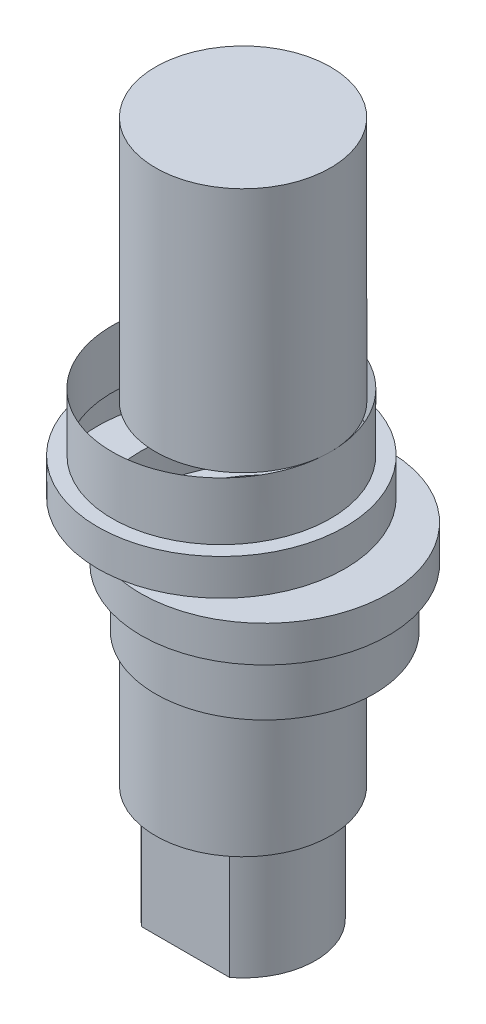
ISO-10303-21;
HEADER;
FILE_DESCRIPTION(('STEP AP214'),'2;1');
FILE_NAME('part.step','',(''),(''),'','','');
FILE_SCHEMA(('AUTOMOTIVE_DESIGN { 1 0 10303 214 1 1 1 1 }'));
ENDSEC;
DATA;
#1=APPLICATION_CONTEXT('core data for automotive mechanical design processes');
#2=APPLICATION_PROTOCOL_DEFINITION('international standard','automotive_design',2000,#1);
#3=PRODUCT_CONTEXT('',#1,'mechanical');
#4=PRODUCT('Part','Part','',(#3));
#5=PRODUCT_RELATED_PRODUCT_CATEGORY('part','',(#4));
#6=PRODUCT_DEFINITION_FORMATION('','',#4);
#7=PRODUCT_DEFINITION_CONTEXT('part definition',#1,'design');
#8=PRODUCT_DEFINITION('design','',#6,#7);
#9=PRODUCT_DEFINITION_SHAPE('','',#8);
#10=(LENGTH_UNIT() NAMED_UNIT(*) SI_UNIT(.MILLI.,.METRE.));
#11=(NAMED_UNIT(*) PLANE_ANGLE_UNIT() SI_UNIT($,.RADIAN.));
#12=(NAMED_UNIT(*) SI_UNIT($,.STERADIAN.) SOLID_ANGLE_UNIT());
#13=UNCERTAINTY_MEASURE_WITH_UNIT(LENGTH_MEASURE(1.E-05),#10,'distance_accuracy_value','');
#14=(GEOMETRIC_REPRESENTATION_CONTEXT(3) GLOBAL_UNCERTAINTY_ASSIGNED_CONTEXT((#13)) GLOBAL_UNIT_ASSIGNED_CONTEXT((#10,
#11,#12)) REPRESENTATION_CONTEXT('',''));
#15=CARTESIAN_POINT('',(0.,0.,0.));
#16=DIRECTION('',(0.,0.,1.));
#17=DIRECTION('',(1.,0.,0.));
#18=AXIS2_PLACEMENT_3D('',#15,#16,#17);
#19=CARTESIAN_POINT('',(0.,19.,0.));
#20=DIRECTION('',(0.,1.,0.));
#21=DIRECTION('',(0.,0.,1.));
#22=AXIS2_PLACEMENT_3D('',#19,#20,#21);
#23=PLANE('',#22);
#24=CARTESIAN_POINT('',(-1.5,19.,0.));
#25=DIRECTION('',(0.,-1.,0.));
#26=DIRECTION('',(0.,0.,-1.));
#27=AXIS2_PLACEMENT_3D('',#24,#25,#26);
#28=CIRCLE('',#27,7.55);
#29=CARTESIAN_POINT('',(-1.5,19.,-7.55));
#30=VERTEX_POINT('',#29);
#31=EDGE_CURVE('E140',#30,#30,#28,.T.);
#32=ORIENTED_EDGE('',*,*,#31,.T.);
#33=EDGE_LOOP('',(#32));
#34=FACE_BOUND('',#33,.T.);
#35=CARTESIAN_POINT('',(-1.5,19.,0.));
#36=DIRECTION('',(0.,1.,0.));
#37=DIRECTION('',(0.,0.,1.));
#38=AXIS2_PLACEMENT_3D('',#35,#36,#37);
#39=CIRCLE('',#38,8.55);
#40=CARTESIAN_POINT('',(-1.5,19.,8.55));
#41=VERTEX_POINT('',#40);
#42=EDGE_CURVE('E134',#41,#41,#39,.T.);
#43=ORIENTED_EDGE('',*,*,#42,.T.);
#44=EDGE_LOOP('',(#43));
#45=FACE_BOUND('',#44,.T.);
#46=ADVANCED_FACE('F41',(#34,#45),#23,.T.);
#47=CARTESIAN_POINT('',(-1.5,19.,0.));
#48=DIRECTION('',(0.,1.,0.));
#49=DIRECTION('',(0.,0.,1.));
#50=AXIS2_PLACEMENT_3D('',#47,#48,#49);
#51=CYLINDRICAL_SURFACE('',#50,8.55);
#52=CARTESIAN_POINT('',(-1.5,16.5,0.));
#53=DIRECTION('',(0.,1.,0.));
#54=DIRECTION('',(0.,0.,1.));
#55=AXIS2_PLACEMENT_3D('',#52,#53,#54);
#56=CIRCLE('',#55,8.55);
#57=CARTESIAN_POINT('',(0.,16.5,8.41739270795892));
#58=VERTEX_POINT('',#57);
#59=CARTESIAN_POINT('',(0.,16.5,-8.41739270795892));
#60=VERTEX_POINT('',#59);
#61=EDGE_CURVE('E131',#58,#60,#56,.T.);
#62=ORIENTED_EDGE('',*,*,#61,.T.);
#63=EDGE_CURVE('E130',#60,#58,#56,.T.);
#64=ORIENTED_EDGE('',*,*,#63,.T.);
#65=EDGE_LOOP('',(#62,#64));
#66=FACE_BOUND('',#65,.T.);
#67=ORIENTED_EDGE('',*,*,#42,.F.);
#68=EDGE_LOOP('',(#67));
#69=FACE_BOUND('',#68,.T.);
#70=ADVANCED_FACE('F176',(#66,#69),#51,.T.);
#71=CARTESIAN_POINT('',(0.,16.5,0.));
#72=DIRECTION('',(0.,1.,0.));
#73=DIRECTION('',(0.,0.,1.));
#74=AXIS2_PLACEMENT_3D('',#71,#72,#73);
#75=PLANE('',#74);
#76=ORIENTED_EDGE('',*,*,#63,.F.);
#77=CARTESIAN_POINT('',(1.5,16.5,0.));
#78=DIRECTION('',(0.,1.,0.));
#79=DIRECTION('',(0.,0.,1.));
#80=AXIS2_PLACEMENT_3D('',#77,#78,#79);
#81=CIRCLE('',#80,8.55);
#82=EDGE_CURVE('E124',#60,#58,#81,.T.);
#83=ORIENTED_EDGE('',*,*,#82,.T.);
#84=EDGE_LOOP('',(#76,#83));
#85=FACE_BOUND('',#84,.T.);
#86=ADVANCED_FACE('F182',(#85),#75,.F.);
#87=CARTESIAN_POINT('',(0.,40.,0.));
#88=DIRECTION('',(0.,1.,0.));
#89=DIRECTION('',(0.,0.,1.));
#90=AXIS2_PLACEMENT_3D('',#87,#88,#89);
#91=PLANE('',#90);
#92=CARTESIAN_POINT('',(0.,40.,0.));
#93=DIRECTION('',(0.,-1.,0.));
#94=DIRECTION('',(0.,0.,-1.));
#95=AXIS2_PLACEMENT_3D('',#92,#93,#94);
#96=CIRCLE('',#95,6.05);
#97=CARTESIAN_POINT('',(0.,40.,-6.05));
#98=VERTEX_POINT('',#97);
#99=EDGE_CURVE('E149',#98,#98,#96,.T.);
#100=ORIENTED_EDGE('',*,*,#99,.F.);
#101=EDGE_LOOP('',(#100));
#102=FACE_BOUND('',#101,.T.);
#103=ADVANCED_FACE('F43',(#102),#91,.T.);
#104=CARTESIAN_POINT('',(0.,0.,0.));
#105=DIRECTION('',(0.,-1.,0.));
#106=DIRECTION('',(0.,0.,-1.));
#107=AXIS2_PLACEMENT_3D('',#104,#105,#106);
#108=CYLINDRICAL_SURFACE('',#107,6.05);
#109=CARTESIAN_POINT('',(0.,23.,0.));
#110=DIRECTION('',(0.,1.,0.));
#111=DIRECTION('',(0.,0.,1.));
#112=AXIS2_PLACEMENT_3D('',#109,#110,#111);
#113=CIRCLE('',#112,6.05);
#114=CARTESIAN_POINT('',(6.05,23.,0.));
#115=VERTEX_POINT('',#114);
#116=EDGE_CURVE('E49',#115,#115,#113,.F.);
#117=ORIENTED_EDGE('',*,*,#116,.F.);
#118=EDGE_LOOP('',(#117));
#119=FACE_BOUND('',#118,.T.);
#120=ORIENTED_EDGE('',*,*,#99,.T.);
#121=EDGE_LOOP('',(#120));
#122=FACE_BOUND('',#121,.T.);
#123=ADVANCED_FACE('F156',(#119,#122),#108,.T.);
#124=CARTESIAN_POINT('',(0.,23.,0.));
#125=DIRECTION('',(0.,1.,0.));
#126=DIRECTION('',(0.,0.,1.));
#127=AXIS2_PLACEMENT_3D('',#124,#125,#126);
#128=PLANE('',#127);
#129=ORIENTED_EDGE('',*,*,#116,.T.);
#130=CARTESIAN_POINT('',(-1.5,23.,0.));
#131=DIRECTION('',(0.,-1.,0.));
#132=DIRECTION('',(0.,0.,-1.));
#133=AXIS2_PLACEMENT_3D('',#130,#131,#132);
#134=CIRCLE('',#133,7.55);
#135=EDGE_CURVE('E143',#115,#115,#134,.T.);
#136=ORIENTED_EDGE('',*,*,#135,.F.);
#137=EDGE_LOOP('',(#129,#136));
#138=FACE_BOUND('',#137,.T.);
#139=ADVANCED_FACE('F154',(#138),#128,.T.);
#140=CARTESIAN_POINT('',(-1.5,0.,0.));
#141=DIRECTION('',(0.,-1.,0.));
#142=DIRECTION('',(0.,0.,-1.));
#143=AXIS2_PLACEMENT_3D('',#140,#141,#142);
#144=CYLINDRICAL_SURFACE('',#143,7.55);
#145=ORIENTED_EDGE('',*,*,#31,.F.);
#146=EDGE_LOOP('',(#145));
#147=FACE_BOUND('',#146,.T.);
#148=ORIENTED_EDGE('',*,*,#135,.T.);
#149=EDGE_LOOP('',(#148));
#150=FACE_BOUND('',#149,.T.);
#151=ADVANCED_FACE('F159',(#147,#150),#144,.T.);
#152=CARTESIAN_POINT('',(1.5,19.,0.));
#153=DIRECTION('',(0.,1.,0.));
#154=DIRECTION('',(0.,0.,1.));
#155=AXIS2_PLACEMENT_3D('',#152,#153,#154);
#156=CYLINDRICAL_SURFACE('',#155,8.55);
#157=CARTESIAN_POINT('',(1.5,14.,0.));
#158=DIRECTION('',(0.,1.,0.));
#159=DIRECTION('',(0.,0.,1.));
#160=AXIS2_PLACEMENT_3D('',#157,#158,#159);
#161=CIRCLE('',#160,8.55);
#162=CARTESIAN_POINT('',(1.5,14.,8.55));
#163=VERTEX_POINT('',#162);
#164=EDGE_CURVE('E115',#163,#163,#161,.T.);
#165=ORIENTED_EDGE('',*,*,#164,.T.);
#166=EDGE_LOOP('',(#165));
#167=FACE_BOUND('',#166,.T.);
#168=ORIENTED_EDGE('',*,*,#82,.F.);
#169=EDGE_CURVE('E118',#58,#60,#81,.T.);
#170=ORIENTED_EDGE('',*,*,#169,.F.);
#171=EDGE_LOOP('',(#168,#170));
#172=FACE_BOUND('',#171,.T.);
#173=ADVANCED_FACE('F161',(#167,#172),#156,.T.);
#174=CARTESIAN_POINT('',(0.,16.5,0.));
#175=DIRECTION('',(0.,1.,0.));
#176=DIRECTION('',(0.,0.,1.));
#177=AXIS2_PLACEMENT_3D('',#174,#175,#176);
#178=PLANE('',#177);
#179=ORIENTED_EDGE('',*,*,#169,.T.);
#180=ORIENTED_EDGE('',*,*,#61,.F.);
#181=EDGE_LOOP('',(#179,#180));
#182=FACE_BOUND('',#181,.T.);
#183=ADVANCED_FACE('F169',(#182),#178,.T.);
#184=CARTESIAN_POINT('',(0.,14.,0.));
#185=DIRECTION('',(0.,1.,0.));
#186=DIRECTION('',(0.,0.,1.));
#187=AXIS2_PLACEMENT_3D('',#184,#185,#186);
#188=PLANE('',#187);
#189=CARTESIAN_POINT('',(1.5,14.,0.));
#190=DIRECTION('',(0.,1.,0.));
#191=DIRECTION('',(0.,0.,1.));
#192=AXIS2_PLACEMENT_3D('',#189,#190,#191);
#193=CIRCLE('',#192,7.55);
#194=CARTESIAN_POINT('',(1.5,14.,7.55));
#195=VERTEX_POINT('',#194);
#196=EDGE_CURVE('E127',#195,#195,#193,.T.);
#197=ORIENTED_EDGE('',*,*,#196,.T.);
#198=EDGE_LOOP('',(#197));
#199=FACE_BOUND('',#198,.T.);
#200=ORIENTED_EDGE('',*,*,#164,.F.);
#201=EDGE_LOOP('',(#200));
#202=FACE_BOUND('',#201,.T.);
#203=ADVANCED_FACE('F204',(#199,#202),#188,.F.);
#204=CARTESIAN_POINT('',(0.,0.,0.));
#205=DIRECTION('',(0.,1.,0.));
#206=DIRECTION('',(0.,0.,1.));
#207=AXIS2_PLACEMENT_3D('',#204,#205,#206);
#208=PLANE('',#207);
#209=DIRECTION('',(1.,0.,0.));
#210=VECTOR('',#209,1.);
#211=CARTESIAN_POINT('',(0.,0.,-3.96875));
#212=LINE('',#211,#210);
#213=CARTESIAN_POINT('',(-3.04122071502547,0.,-3.96875));
#214=VERTEX_POINT('',#213);
#215=CARTESIAN_POINT('',(3.04122071502547,0.,-3.96875));
#216=VERTEX_POINT('',#215);
#217=EDGE_CURVE('E56',#214,#216,#212,.T.);
#218=ORIENTED_EDGE('',*,*,#217,.F.);
#219=CARTESIAN_POINT('',(0.,0.,0.));
#220=DIRECTION('',(0.,-1.,0.));
#221=DIRECTION('',(0.,0.,-1.));
#222=AXIS2_PLACEMENT_3D('',#219,#220,#221);
#223=CIRCLE('',#222,5.);
#224=CARTESIAN_POINT('',(-3.04122071502547,0.,3.96875));
#225=VERTEX_POINT('',#224);
#226=EDGE_CURVE('E60',#225,#214,#223,.T.);
#227=ORIENTED_EDGE('',*,*,#226,.F.);
#228=DIRECTION('',(1.,0.,0.));
#229=VECTOR('',#228,1.);
#230=CARTESIAN_POINT('',(0.,0.,3.96875));
#231=LINE('',#230,#229);
#232=CARTESIAN_POINT('',(3.04122071502547,0.,3.96875));
#233=VERTEX_POINT('',#232);
#234=EDGE_CURVE('E390',#225,#233,#231,.T.);
#235=ORIENTED_EDGE('',*,*,#234,.T.);
#236=EDGE_CURVE('E384',#216,#233,#223,.T.);
#237=ORIENTED_EDGE('',*,*,#236,.F.);
#238=EDGE_LOOP('',(#218,#227,#235,#237));
#239=FACE_BOUND('',#238,.T.);
#240=CARTESIAN_POINT('',(0.,0.,0.));
#241=DIRECTION('',(0.,-1.,0.));
#242=DIRECTION('',(0.,0.,-1.));
#243=AXIS2_PLACEMENT_3D('',#240,#241,#242);
#244=CIRCLE('',#243,6.05);
#245=CARTESIAN_POINT('',(0.,0.,-6.05));
#246=VERTEX_POINT('',#245);
#247=EDGE_CURVE('E146',#246,#246,#244,.T.);
#248=ORIENTED_EDGE('',*,*,#247,.T.);
#249=EDGE_LOOP('',(#248));
#250=FACE_BOUND('',#249,.T.);
#251=ADVANCED_FACE('F198',(#239,#250),#208,.F.);
#252=CARTESIAN_POINT('',(0.,10.,0.));
#253=DIRECTION('',(0.,-1.,0.));
#254=DIRECTION('',(0.,0.,-1.));
#255=AXIS2_PLACEMENT_3D('',#252,#253,#254);
#256=CIRCLE('',#255,6.05);
#257=CARTESIAN_POINT('',(-6.05,10.,0.));
#258=VERTEX_POINT('',#257);
#259=EDGE_CURVE('E11',#258,#258,#256,.F.);
#260=ORIENTED_EDGE('',*,*,#259,.F.);
#261=EDGE_LOOP('',(#260));
#262=FACE_BOUND('',#261,.T.);
#263=ORIENTED_EDGE('',*,*,#247,.F.);
#264=EDGE_LOOP('',(#263));
#265=FACE_BOUND('',#264,.T.);
#266=ADVANCED_FACE('F193',(#262,#265),#108,.T.);
#267=CARTESIAN_POINT('',(0.,10.,0.));
#268=DIRECTION('',(0.,-1.,0.));
#269=DIRECTION('',(0.,0.,-1.));
#270=AXIS2_PLACEMENT_3D('',#267,#268,#269);
#271=PLANE('',#270);
#272=CARTESIAN_POINT('',(1.5,10.,0.));
#273=DIRECTION('',(0.,-1.,0.));
#274=DIRECTION('',(0.,0.,-1.));
#275=AXIS2_PLACEMENT_3D('',#272,#273,#274);
#276=CIRCLE('',#275,7.55);
#277=EDGE_CURVE('E137',#258,#258,#276,.T.);
#278=ORIENTED_EDGE('',*,*,#277,.T.);
#279=ORIENTED_EDGE('',*,*,#259,.T.);
#280=EDGE_LOOP('',(#278,#279));
#281=FACE_BOUND('',#280,.T.);
#282=ADVANCED_FACE('F190',(#281),#271,.T.);
#283=CARTESIAN_POINT('',(1.5,0.,0.));
#284=DIRECTION('',(0.,-1.,0.));
#285=DIRECTION('',(0.,0.,-1.));
#286=AXIS2_PLACEMENT_3D('',#283,#284,#285);
#287=CYLINDRICAL_SURFACE('',#286,7.55);
#288=ORIENTED_EDGE('',*,*,#277,.F.);
#289=EDGE_LOOP('',(#288));
#290=FACE_BOUND('',#289,.T.);
#291=ORIENTED_EDGE('',*,*,#196,.F.);
#292=EDGE_LOOP('',(#291));
#293=FACE_BOUND('',#292,.T.);
#294=ADVANCED_FACE('F188',(#290,#293),#287,.T.);
#295=CARTESIAN_POINT('',(0.,-8.,-3.96875));
#296=DIRECTION('',(0.,0.,1.));
#297=DIRECTION('',(1.,0.,0.));
#298=AXIS2_PLACEMENT_3D('',#295,#296,#297);
#299=PLANE('',#298);
#300=ORIENTED_EDGE('',*,*,#217,.T.);
#301=DIRECTION('',(0.,1.,0.));
#302=VECTOR('',#301,1.);
#303=CARTESIAN_POINT('',(3.04122071502547,-8.,-3.96875));
#304=LINE('',#303,#302);
#305=CARTESIAN_POINT('',(3.04122071502547,-8.,-3.96875));
#306=VERTEX_POINT('',#305);
#307=EDGE_CURVE('E97',#306,#216,#304,.T.);
#308=ORIENTED_EDGE('',*,*,#307,.F.);
#309=DIRECTION('',(1.,0.,0.));
#310=VECTOR('',#309,1.);
#311=CARTESIAN_POINT('',(0.,-8.,-3.96875));
#312=LINE('',#311,#310);
#313=CARTESIAN_POINT('',(-3.04122071502547,-8.,-3.96875));
#314=VERTEX_POINT('',#313);
#315=EDGE_CURVE('E104',#314,#306,#312,.T.);
#316=ORIENTED_EDGE('',*,*,#315,.F.);
#317=DIRECTION('',(0.,1.,0.));
#318=VECTOR('',#317,1.);
#319=CARTESIAN_POINT('',(-3.04122071502547,-8.,-3.96875));
#320=LINE('',#319,#318);
#321=EDGE_CURVE('E392',#314,#214,#320,.T.);
#322=ORIENTED_EDGE('',*,*,#321,.T.);
#323=EDGE_LOOP('',(#300,#308,#316,#322));
#324=FACE_BOUND('',#323,.T.);
#325=ADVANCED_FACE('F114',(#324),#299,.F.);
#326=CARTESIAN_POINT('',(0.,-8.,0.));
#327=DIRECTION('',(0.,1.,0.));
#328=DIRECTION('',(0.,0.,1.));
#329=AXIS2_PLACEMENT_3D('',#326,#327,#328);
#330=CYLINDRICAL_SURFACE('',#329,5.);
#331=ORIENTED_EDGE('',*,*,#236,.T.);
#332=DIRECTION('',(0.,1.,0.));
#333=VECTOR('',#332,1.);
#334=CARTESIAN_POINT('',(3.04122071502547,-8.,3.96875));
#335=LINE('',#334,#333);
#336=CARTESIAN_POINT('',(3.04122071502547,-8.,3.96875));
#337=VERTEX_POINT('',#336);
#338=EDGE_CURVE('E99',#337,#233,#335,.T.);
#339=ORIENTED_EDGE('',*,*,#338,.F.);
#340=CARTESIAN_POINT('',(0.,-8.,0.));
#341=DIRECTION('',(0.,-1.,0.));
#342=DIRECTION('',(0.,0.,-1.));
#343=AXIS2_PLACEMENT_3D('',#340,#341,#342);
#344=CIRCLE('',#343,5.);
#345=EDGE_CURVE('E92',#306,#337,#344,.T.);
#346=ORIENTED_EDGE('',*,*,#345,.F.);
#347=ORIENTED_EDGE('',*,*,#307,.T.);
#348=EDGE_LOOP('',(#331,#339,#346,#347));
#349=FACE_BOUND('',#348,.T.);
#350=ADVANCED_FACE('F95',(#349),#330,.T.);
#351=CARTESIAN_POINT('',(0.,-8.,3.96875));
#352=DIRECTION('',(0.,0.,1.));
#353=DIRECTION('',(1.,0.,0.));
#354=AXIS2_PLACEMENT_3D('',#351,#352,#353);
#355=PLANE('',#354);
#356=ORIENTED_EDGE('',*,*,#234,.F.);
#357=DIRECTION('',(0.,1.,0.));
#358=VECTOR('',#357,1.);
#359=CARTESIAN_POINT('',(-3.04122071502547,-8.,3.96875));
#360=LINE('',#359,#358);
#361=CARTESIAN_POINT('',(-3.04122071502547,-8.,3.96875));
#362=VERTEX_POINT('',#361);
#363=EDGE_CURVE('E120',#362,#225,#360,.T.);
#364=ORIENTED_EDGE('',*,*,#363,.F.);
#365=DIRECTION('',(1.,0.,0.));
#366=VECTOR('',#365,1.);
#367=CARTESIAN_POINT('',(0.,-8.,3.96875));
#368=LINE('',#367,#366);
#369=EDGE_CURVE('E103',#362,#337,#368,.T.);
#370=ORIENTED_EDGE('',*,*,#369,.T.);
#371=ORIENTED_EDGE('',*,*,#338,.T.);
#372=EDGE_LOOP('',(#356,#364,#370,#371));
#373=FACE_BOUND('',#372,.T.);
#374=ADVANCED_FACE('F256',(#373),#355,.T.);
#375=ORIENTED_EDGE('',*,*,#226,.T.);
#376=ORIENTED_EDGE('',*,*,#321,.F.);
#377=EDGE_CURVE('E106',#362,#314,#344,.T.);
#378=ORIENTED_EDGE('',*,*,#377,.F.);
#379=ORIENTED_EDGE('',*,*,#363,.T.);
#380=EDGE_LOOP('',(#375,#376,#378,#379));
#381=FACE_BOUND('',#380,.T.);
#382=ADVANCED_FACE('F258',(#381),#330,.T.);
#383=CARTESIAN_POINT('',(0.,-8.,0.));
#384=DIRECTION('',(0.,-1.,0.));
#385=DIRECTION('',(0.,0.,-1.));
#386=AXIS2_PLACEMENT_3D('',#383,#384,#385);
#387=PLANE('',#386);
#388=CARTESIAN_POINT('',(0.,-8.,0.));
#389=DIRECTION('',(0.,-1.,0.));
#390=DIRECTION('',(0.,0.,-1.));
#391=AXIS2_PLACEMENT_3D('',#388,#389,#390);
#392=CIRCLE('',#391,1.55);
#393=CARTESIAN_POINT('',(0.,-8.,-1.55));
#394=VERTEX_POINT('',#393);
#395=EDGE_CURVE('E379',#394,#394,#392,.T.);
#396=ORIENTED_EDGE('',*,*,#395,.F.);
#397=EDGE_LOOP('',(#396));
#398=FACE_BOUND('',#397,.T.);
#399=ORIENTED_EDGE('',*,*,#315,.T.);
#400=ORIENTED_EDGE('',*,*,#345,.T.);
#401=ORIENTED_EDGE('',*,*,#369,.F.);
#402=ORIENTED_EDGE('',*,*,#377,.T.);
#403=EDGE_LOOP('',(#399,#400,#401,#402));
#404=FACE_BOUND('',#403,.T.);
#405=ADVANCED_FACE('F108',(#398,#404),#387,.T.);
#406=CARTESIAN_POINT('',(0.,0.,0.));
#407=DIRECTION('',(0.,1.,0.));
#408=DIRECTION('',(0.,0.,1.));
#409=AXIS2_PLACEMENT_3D('',#406,#407,#408);
#410=PLANE('',#409);
#411=CARTESIAN_POINT('',(0.,0.,0.));
#412=DIRECTION('',(0.,1.,0.));
#413=DIRECTION('',(0.,0.,1.));
#414=AXIS2_PLACEMENT_3D('',#411,#412,#413);
#415=CIRCLE('',#414,1.55);
#416=CARTESIAN_POINT('',(0.,0.,1.55));
#417=VERTEX_POINT('',#416);
#418=EDGE_CURVE('E382',#417,#417,#415,.F.);
#419=ORIENTED_EDGE('',*,*,#418,.T.);
#420=EDGE_LOOP('',(#419));
#421=FACE_BOUND('',#420,.T.);
#422=ADVANCED_FACE('F280',(#421),#410,.F.);
#423=CARTESIAN_POINT('',(0.,4.38406204335659,0.));
#424=DIRECTION('',(0.,-1.,0.));
#425=DIRECTION('',(0.,0.,-1.));
#426=AXIS2_PLACEMENT_3D('',#423,#424,#425);
#427=CYLINDRICAL_SURFACE('',#426,1.55);
#428=ORIENTED_EDGE('',*,*,#395,.T.);
#429=EDGE_LOOP('',(#428));
#430=FACE_BOUND('',#429,.T.);
#431=ORIENTED_EDGE('',*,*,#418,.F.);
#432=EDGE_LOOP('',(#431));
#433=FACE_BOUND('',#432,.T.);
#434=ADVANCED_FACE('F289',(#430,#433),#427,.F.);
#435=CLOSED_SHELL('',(#46,#70,#86,#103,#123,#139,#151,#173,#183,#203,#251,#266,#282,#294,#325,
#350,#374,#382,#405,#422,#434));
#436=MANIFOLD_SOLID_BREP('B2',#435);
#437=ADVANCED_BREP_SHAPE_REPRESENTATION('',(#18,#436),#14);
#438=SHAPE_DEFINITION_REPRESENTATION(#9,#437);
ENDSEC;
END-ISO-10303-21;
